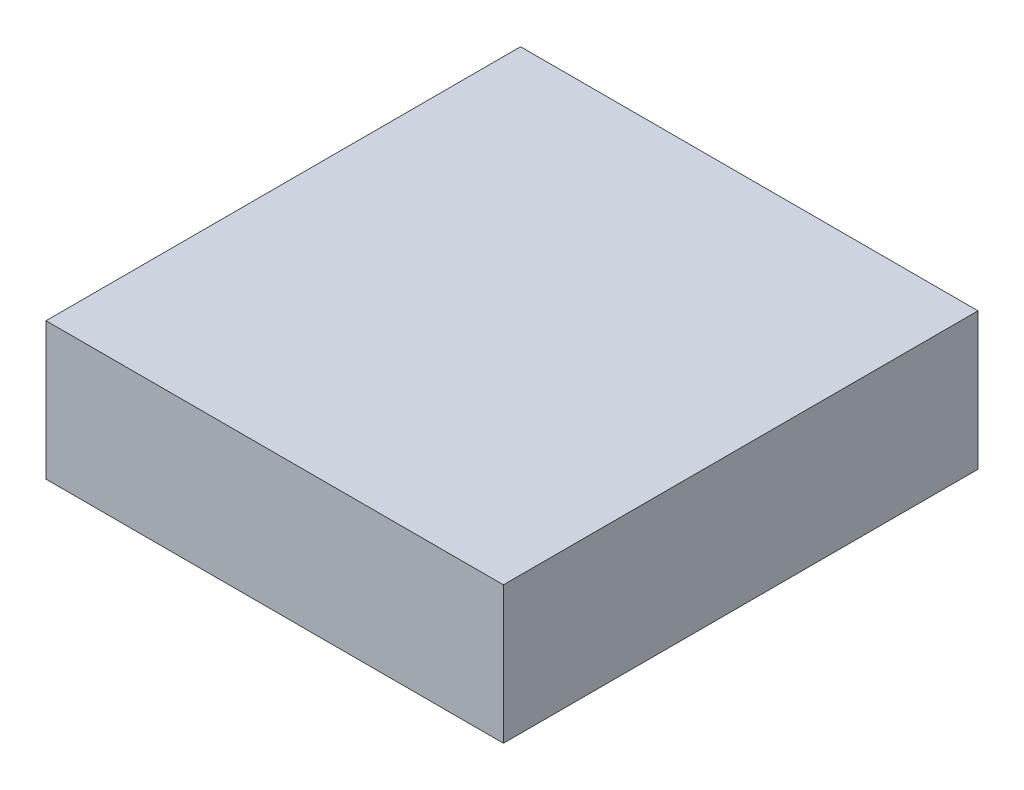
ISO-10303-21;
HEADER;
FILE_DESCRIPTION(('STEP AP214'),'2;1');
FILE_NAME('part.step','',(''),(''),'','','');
FILE_SCHEMA(('AUTOMOTIVE_DESIGN { 1 0 10303 214 1 1 1 1 }'));
ENDSEC;
DATA;
#1=APPLICATION_CONTEXT('core data for automotive mechanical design processes');
#2=APPLICATION_PROTOCOL_DEFINITION('international standard','automotive_design',2000,#1);
#3=PRODUCT_CONTEXT('',#1,'mechanical');
#4=PRODUCT('Part','Part','',(#3));
#5=PRODUCT_RELATED_PRODUCT_CATEGORY('part','',(#4));
#6=PRODUCT_DEFINITION_FORMATION('','',#4);
#7=PRODUCT_DEFINITION_CONTEXT('part definition',#1,'design');
#8=PRODUCT_DEFINITION('design','',#6,#7);
#9=PRODUCT_DEFINITION_SHAPE('','',#8);
#10=(LENGTH_UNIT() NAMED_UNIT(*) SI_UNIT(.MILLI.,.METRE.));
#11=(NAMED_UNIT(*) PLANE_ANGLE_UNIT() SI_UNIT($,.RADIAN.));
#12=(NAMED_UNIT(*) SI_UNIT($,.STERADIAN.) SOLID_ANGLE_UNIT());
#13=UNCERTAINTY_MEASURE_WITH_UNIT(LENGTH_MEASURE(1.E-05),#10,'distance_accuracy_value','');
#14=(GEOMETRIC_REPRESENTATION_CONTEXT(3) GLOBAL_UNCERTAINTY_ASSIGNED_CONTEXT((#13)) GLOBAL_UNIT_ASSIGNED_CONTEXT((#10,
#11,#12)) REPRESENTATION_CONTEXT('',''));
#15=CARTESIAN_POINT('',(0.,0.,0.));
#16=DIRECTION('',(0.,0.,1.));
#17=DIRECTION('',(1.,0.,0.));
#18=AXIS2_PLACEMENT_3D('',#15,#16,#17);
#19=CARTESIAN_POINT('',(0.8,0.48,-0.83));
#20=DIRECTION('',(-1.,0.,0.));
#21=DIRECTION('',(0.,0.,1.));
#22=AXIS2_PLACEMENT_3D('',#19,#20,#21);
#23=PLANE('',#22);
#24=DIRECTION('',(0.,0.,-1.));
#25=VECTOR('',#24,1.);
#26=CARTESIAN_POINT('',(0.8,0.,-0.83));
#27=LINE('',#26,#25);
#28=CARTESIAN_POINT('',(0.8,0.,0.83));
#29=VERTEX_POINT('',#28);
#30=CARTESIAN_POINT('',(0.8,0.,-0.83));
#31=VERTEX_POINT('',#30);
#32=EDGE_CURVE('E99',#29,#31,#27,.T.);
#33=ORIENTED_EDGE('',*,*,#32,.T.);
#34=DIRECTION('',(0.,-1.,0.));
#35=VECTOR('',#34,1.);
#36=CARTESIAN_POINT('',(0.8,0.48,-0.83));
#37=LINE('',#36,#35);
#38=CARTESIAN_POINT('',(0.8,0.48,-0.83));
#39=VERTEX_POINT('',#38);
#40=EDGE_CURVE('E11',#39,#31,#37,.T.);
#41=ORIENTED_EDGE('',*,*,#40,.F.);
#42=DIRECTION('',(0.,0.,-1.));
#43=VECTOR('',#42,1.);
#44=CARTESIAN_POINT('',(0.8,0.48,-0.83));
#45=LINE('',#44,#43);
#46=CARTESIAN_POINT('',(0.8,0.48,0.83));
#47=VERTEX_POINT('',#46);
#48=EDGE_CURVE('E87',#47,#39,#45,.T.);
#49=ORIENTED_EDGE('',*,*,#48,.F.);
#50=DIRECTION('',(0.,-1.,0.));
#51=VECTOR('',#50,1.);
#52=CARTESIAN_POINT('',(0.8,0.48,0.83));
#53=LINE('',#52,#51);
#54=EDGE_CURVE('E95',#47,#29,#53,.T.);
#55=ORIENTED_EDGE('',*,*,#54,.T.);
#56=EDGE_LOOP('',(#33,#41,#49,#55));
#57=FACE_BOUND('',#56,.T.);
#58=ADVANCED_FACE('F36',(#57),#23,.F.);
#59=CARTESIAN_POINT('',(-0.8,0.48,-0.83));
#60=DIRECTION('',(0.,0.,1.));
#61=DIRECTION('',(1.,0.,0.));
#62=AXIS2_PLACEMENT_3D('',#59,#60,#61);
#63=PLANE('',#62);
#64=DIRECTION('',(-1.,0.,0.));
#65=VECTOR('',#64,1.);
#66=CARTESIAN_POINT('',(-0.8,0.,-0.83));
#67=LINE('',#66,#65);
#68=CARTESIAN_POINT('',(-0.8,0.,-0.83));
#69=VERTEX_POINT('',#68);
#70=EDGE_CURVE('E91',#31,#69,#67,.T.);
#71=ORIENTED_EDGE('',*,*,#70,.T.);
#72=DIRECTION('',(0.,-1.,0.));
#73=VECTOR('',#72,1.);
#74=CARTESIAN_POINT('',(-0.8,0.48,-0.83));
#75=LINE('',#74,#73);
#76=CARTESIAN_POINT('',(-0.8,0.48,-0.83));
#77=VERTEX_POINT('',#76);
#78=EDGE_CURVE('E44',#77,#69,#75,.T.);
#79=ORIENTED_EDGE('',*,*,#78,.F.);
#80=DIRECTION('',(-1.,0.,0.));
#81=VECTOR('',#80,1.);
#82=CARTESIAN_POINT('',(-0.8,0.48,-0.83));
#83=LINE('',#82,#81);
#84=EDGE_CURVE('E82',#39,#77,#83,.T.);
#85=ORIENTED_EDGE('',*,*,#84,.F.);
#86=ORIENTED_EDGE('',*,*,#40,.T.);
#87=EDGE_LOOP('',(#71,#79,#85,#86));
#88=FACE_BOUND('',#87,.T.);
#89=ADVANCED_FACE('F90',(#88),#63,.F.);
#90=CARTESIAN_POINT('',(-0.8,0.48,-0.83));
#91=DIRECTION('',(1.,0.,0.));
#92=DIRECTION('',(0.,0.,-1.));
#93=AXIS2_PLACEMENT_3D('',#90,#91,#92);
#94=PLANE('',#93);
#95=DIRECTION('',(0.,0.,1.));
#96=VECTOR('',#95,1.);
#97=CARTESIAN_POINT('',(-0.8,0.,-0.83));
#98=LINE('',#97,#96);
#99=CARTESIAN_POINT('',(-0.8,0.,0.83));
#100=VERTEX_POINT('',#99);
#101=EDGE_CURVE('E69',#69,#100,#98,.T.);
#102=ORIENTED_EDGE('',*,*,#101,.T.);
#103=DIRECTION('',(0.,-1.,0.));
#104=VECTOR('',#103,1.);
#105=CARTESIAN_POINT('',(-0.8,0.48,0.83));
#106=LINE('',#105,#104);
#107=CARTESIAN_POINT('',(-0.8,0.48,0.83));
#108=VERTEX_POINT('',#107);
#109=EDGE_CURVE('E92',#108,#100,#106,.T.);
#110=ORIENTED_EDGE('',*,*,#109,.F.);
#111=DIRECTION('',(0.,0.,1.));
#112=VECTOR('',#111,1.);
#113=CARTESIAN_POINT('',(-0.8,0.48,-0.83));
#114=LINE('',#113,#112);
#115=EDGE_CURVE('E85',#77,#108,#114,.T.);
#116=ORIENTED_EDGE('',*,*,#115,.F.);
#117=ORIENTED_EDGE('',*,*,#78,.T.);
#118=EDGE_LOOP('',(#102,#110,#116,#117));
#119=FACE_BOUND('',#118,.T.);
#120=ADVANCED_FACE('F93',(#119),#94,.F.);
#121=CARTESIAN_POINT('',(-0.8,0.48,0.83));
#122=DIRECTION('',(0.,0.,-1.));
#123=DIRECTION('',(-1.,0.,0.));
#124=AXIS2_PLACEMENT_3D('',#121,#122,#123);
#125=PLANE('',#124);
#126=DIRECTION('',(1.,0.,0.));
#127=VECTOR('',#126,1.);
#128=CARTESIAN_POINT('',(-0.8,0.,0.83));
#129=LINE('',#128,#127);
#130=EDGE_CURVE('E75',#100,#29,#129,.T.);
#131=ORIENTED_EDGE('',*,*,#130,.T.);
#132=ORIENTED_EDGE('',*,*,#54,.F.);
#133=DIRECTION('',(1.,0.,0.));
#134=VECTOR('',#133,1.);
#135=CARTESIAN_POINT('',(-0.8,0.48,0.83));
#136=LINE('',#135,#134);
#137=EDGE_CURVE('E52',#108,#47,#136,.T.);
#138=ORIENTED_EDGE('',*,*,#137,.F.);
#139=ORIENTED_EDGE('',*,*,#109,.T.);
#140=EDGE_LOOP('',(#131,#132,#138,#139));
#141=FACE_BOUND('',#140,.T.);
#142=ADVANCED_FACE('F106',(#141),#125,.F.);
#143=CARTESIAN_POINT('',(0.,0.48,0.));
#144=DIRECTION('',(0.,1.,0.));
#145=DIRECTION('',(0.,0.,1.));
#146=AXIS2_PLACEMENT_3D('',#143,#144,#145);
#147=PLANE('',#146);
#148=ORIENTED_EDGE('',*,*,#48,.T.);
#149=ORIENTED_EDGE('',*,*,#84,.T.);
#150=ORIENTED_EDGE('',*,*,#115,.T.);
#151=ORIENTED_EDGE('',*,*,#137,.T.);
#152=EDGE_LOOP('',(#148,#149,#150,#151));
#153=FACE_BOUND('',#152,.T.);
#154=ADVANCED_FACE('F83',(#153),#147,.T.);
#155=CARTESIAN_POINT('',(0.,0.,0.));
#156=DIRECTION('',(0.,1.,0.));
#157=DIRECTION('',(0.,0.,1.));
#158=AXIS2_PLACEMENT_3D('',#155,#156,#157);
#159=PLANE('',#158);
#160=ORIENTED_EDGE('',*,*,#32,.F.);
#161=ORIENTED_EDGE('',*,*,#130,.F.);
#162=ORIENTED_EDGE('',*,*,#101,.F.);
#163=ORIENTED_EDGE('',*,*,#70,.F.);
#164=EDGE_LOOP('',(#160,#161,#162,#163));
#165=FACE_BOUND('',#164,.T.);
#166=ADVANCED_FACE('F109',(#165),#159,.F.);
#167=CLOSED_SHELL('',(#58,#89,#120,#142,#154,#166));
#168=MANIFOLD_SOLID_BREP('B2',#167);
#169=ADVANCED_BREP_SHAPE_REPRESENTATION('',(#18,#168),#14);
#170=SHAPE_DEFINITION_REPRESENTATION(#9,#169);
ENDSEC;
END-ISO-10303-21;
